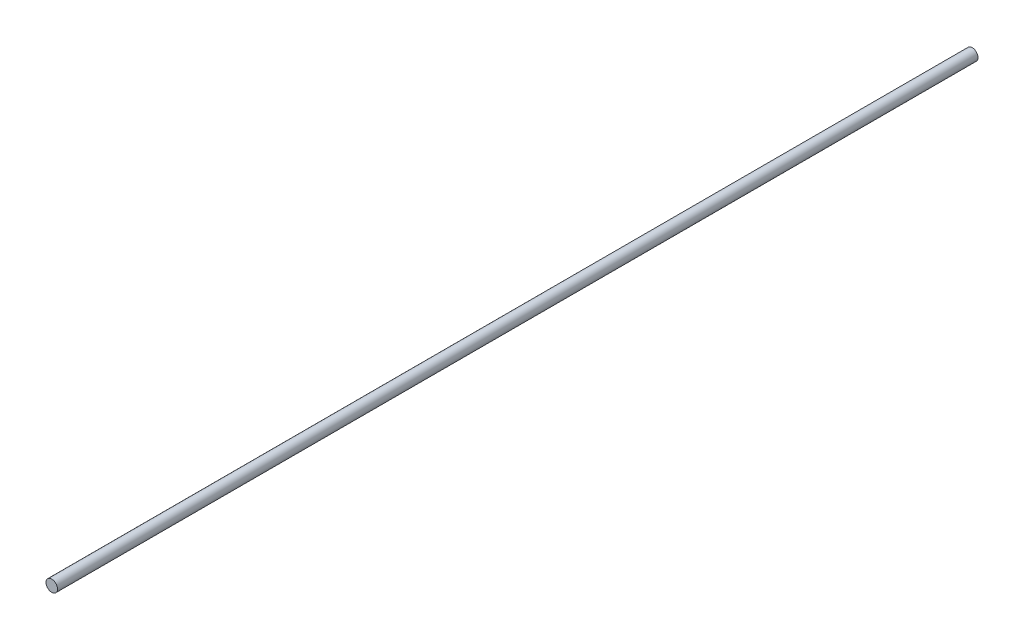
ISO-10303-21;
HEADER;
FILE_DESCRIPTION(('STEP AP214'),'2;1');
FILE_NAME('part.step','',(''),(''),'','','');
FILE_SCHEMA(('AUTOMOTIVE_DESIGN { 1 0 10303 214 1 1 1 1 }'));
ENDSEC;
DATA;
#1=APPLICATION_CONTEXT('core data for automotive mechanical design processes');
#2=APPLICATION_PROTOCOL_DEFINITION('international standard','automotive_design',2000,#1);
#3=PRODUCT_CONTEXT('',#1,'mechanical');
#4=PRODUCT('Part','Part','',(#3));
#5=PRODUCT_RELATED_PRODUCT_CATEGORY('part','',(#4));
#6=PRODUCT_DEFINITION_FORMATION('','',#4);
#7=PRODUCT_DEFINITION_CONTEXT('part definition',#1,'design');
#8=PRODUCT_DEFINITION('design','',#6,#7);
#9=PRODUCT_DEFINITION_SHAPE('','',#8);
#10=(LENGTH_UNIT() NAMED_UNIT(*) SI_UNIT(.MILLI.,.METRE.));
#11=(NAMED_UNIT(*) PLANE_ANGLE_UNIT() SI_UNIT($,.RADIAN.));
#12=(NAMED_UNIT(*) SI_UNIT($,.STERADIAN.) SOLID_ANGLE_UNIT());
#13=UNCERTAINTY_MEASURE_WITH_UNIT(LENGTH_MEASURE(1.E-05),#10,'distance_accuracy_value','');
#14=(GEOMETRIC_REPRESENTATION_CONTEXT(3) GLOBAL_UNCERTAINTY_ASSIGNED_CONTEXT((#13)) GLOBAL_UNIT_ASSIGNED_CONTEXT((#10,
#11,#12)) REPRESENTATION_CONTEXT('',''));
#15=CARTESIAN_POINT('',(0.,0.,0.));
#16=DIRECTION('',(0.,0.,1.));
#17=DIRECTION('',(1.,0.,0.));
#18=AXIS2_PLACEMENT_3D('',#15,#16,#17);
#19=CARTESIAN_POINT('',(0.,0.,254.));
#20=DIRECTION('',(0.,0.,-1.));
#21=DIRECTION('',(-1.,0.,0.));
#22=AXIS2_PLACEMENT_3D('',#19,#20,#21);
#23=CYLINDRICAL_SURFACE('',#22,3.175);
#24=CARTESIAN_POINT('',(0.,0.,254.));
#25=DIRECTION('',(0.,0.,1.));
#26=DIRECTION('',(1.,0.,0.));
#27=AXIS2_PLACEMENT_3D('',#24,#25,#26);
#28=CIRCLE('',#27,3.175);
#29=CARTESIAN_POINT('',(3.175,0.,254.));
#30=VERTEX_POINT('',#29);
#31=EDGE_CURVE('E10',#30,#30,#28,.T.);
#32=ORIENTED_EDGE('',*,*,#31,.F.);
#33=EDGE_LOOP('',(#32));
#34=FACE_BOUND('',#33,.T.);
#35=CARTESIAN_POINT('',(0.,0.,-254.));
#36=DIRECTION('',(0.,0.,1.));
#37=DIRECTION('',(1.,0.,0.));
#38=AXIS2_PLACEMENT_3D('',#35,#36,#37);
#39=CIRCLE('',#38,3.175);
#40=CARTESIAN_POINT('',(3.175,0.,-254.));
#41=VERTEX_POINT('',#40);
#42=EDGE_CURVE('E40',#41,#41,#39,.T.);
#43=ORIENTED_EDGE('',*,*,#42,.T.);
#44=EDGE_LOOP('',(#43));
#45=FACE_BOUND('',#44,.T.);
#46=ADVANCED_FACE('F37',(#34,#45),#23,.T.);
#47=CARTESIAN_POINT('',(0.,0.,254.));
#48=DIRECTION('',(0.,0.,1.));
#49=DIRECTION('',(1.,0.,0.));
#50=AXIS2_PLACEMENT_3D('',#47,#48,#49);
#51=PLANE('',#50);
#52=ORIENTED_EDGE('',*,*,#31,.T.);
#53=EDGE_LOOP('',(#52));
#54=FACE_BOUND('',#53,.T.);
#55=ADVANCED_FACE('F54',(#54),#51,.T.);
#56=CARTESIAN_POINT('',(0.,0.,-254.));
#57=DIRECTION('',(0.,0.,1.));
#58=DIRECTION('',(1.,0.,0.));
#59=AXIS2_PLACEMENT_3D('',#56,#57,#58);
#60=PLANE('',#59);
#61=ORIENTED_EDGE('',*,*,#42,.F.);
#62=EDGE_LOOP('',(#61));
#63=FACE_BOUND('',#62,.T.);
#64=ADVANCED_FACE('F52',(#63),#60,.F.);
#65=CLOSED_SHELL('',(#46,#55,#64));
#66=MANIFOLD_SOLID_BREP('B2',#65);
#67=ADVANCED_BREP_SHAPE_REPRESENTATION('',(#18,#66),#14);
#68=SHAPE_DEFINITION_REPRESENTATION(#9,#67);
ENDSEC;
END-ISO-10303-21;
